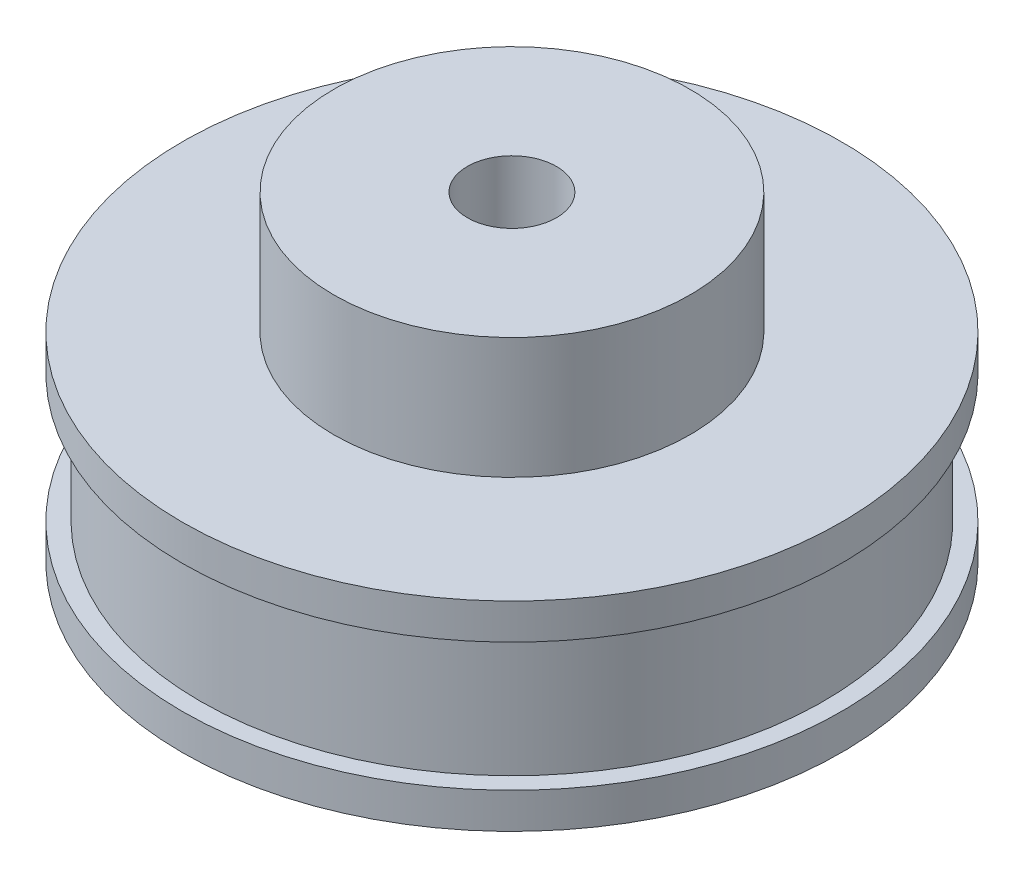
ISO-10303-21;
HEADER;
FILE_DESCRIPTION(('STEP AP214'),'2;1');
FILE_NAME('part.step','',(''),(''),'','','');
FILE_SCHEMA(('AUTOMOTIVE_DESIGN { 1 0 10303 214 1 1 1 1 }'));
ENDSEC;
DATA;
#1=APPLICATION_CONTEXT('core data for automotive mechanical design processes');
#2=APPLICATION_PROTOCOL_DEFINITION('international standard','automotive_design',2000,#1);
#3=PRODUCT_CONTEXT('',#1,'mechanical');
#4=PRODUCT('Part','Part','',(#3));
#5=PRODUCT_RELATED_PRODUCT_CATEGORY('part','',(#4));
#6=PRODUCT_DEFINITION_FORMATION('','',#4);
#7=PRODUCT_DEFINITION_CONTEXT('part definition',#1,'design');
#8=PRODUCT_DEFINITION('design','',#6,#7);
#9=PRODUCT_DEFINITION_SHAPE('','',#8);
#10=(LENGTH_UNIT() NAMED_UNIT(*) SI_UNIT(.MILLI.,.METRE.));
#11=(NAMED_UNIT(*) PLANE_ANGLE_UNIT() SI_UNIT($,.RADIAN.));
#12=(NAMED_UNIT(*) SI_UNIT($,.STERADIAN.) SOLID_ANGLE_UNIT());
#13=UNCERTAINTY_MEASURE_WITH_UNIT(LENGTH_MEASURE(1.E-05),#10,'distance_accuracy_value','');
#14=(GEOMETRIC_REPRESENTATION_CONTEXT(3) GLOBAL_UNCERTAINTY_ASSIGNED_CONTEXT((#13)) GLOBAL_UNIT_ASSIGNED_CONTEXT((#10,
#11,#12)) REPRESENTATION_CONTEXT('',''));
#15=CARTESIAN_POINT('',(0.,0.,0.));
#16=DIRECTION('',(0.,0.,1.));
#17=DIRECTION('',(1.,0.,0.));
#18=AXIS2_PLACEMENT_3D('',#15,#16,#17);
#19=CARTESIAN_POINT('',(0.,2.,0.));
#20=DIRECTION('',(0.,-1.,0.));
#21=DIRECTION('',(0.,0.,-1.));
#22=AXIS2_PLACEMENT_3D('',#19,#20,#21);
#23=CYLINDRICAL_SURFACE('',#22,18.5);
#24=CARTESIAN_POINT('',(0.,2.,0.));
#25=DIRECTION('',(0.,1.,0.));
#26=DIRECTION('',(0.,0.,1.));
#27=AXIS2_PLACEMENT_3D('',#24,#25,#26);
#28=CIRCLE('',#27,18.5);
#29=CARTESIAN_POINT('',(0.,2.,18.5));
#30=VERTEX_POINT('',#29);
#31=EDGE_CURVE('E48',#30,#30,#28,.T.);
#32=ORIENTED_EDGE('',*,*,#31,.F.);
#33=EDGE_LOOP('',(#32));
#34=FACE_BOUND('',#33,.T.);
#35=CARTESIAN_POINT('',(0.,0.,0.));
#36=DIRECTION('',(0.,1.,0.));
#37=DIRECTION('',(0.,0.,1.));
#38=AXIS2_PLACEMENT_3D('',#35,#36,#37);
#39=CIRCLE('',#38,18.5);
#40=CARTESIAN_POINT('',(0.,0.,18.5));
#41=VERTEX_POINT('',#40);
#42=EDGE_CURVE('E39',#41,#41,#39,.T.);
#43=ORIENTED_EDGE('',*,*,#42,.T.);
#44=EDGE_LOOP('',(#43));
#45=FACE_BOUND('',#44,.T.);
#46=ADVANCED_FACE('F36',(#34,#45),#23,.T.);
#47=CARTESIAN_POINT('',(0.,2.,0.));
#48=DIRECTION('',(0.,1.,0.));
#49=DIRECTION('',(0.,0.,1.));
#50=AXIS2_PLACEMENT_3D('',#47,#48,#49);
#51=PLANE('',#50);
#52=CARTESIAN_POINT('',(0.,2.,0.));
#53=DIRECTION('',(0.,1.,0.));
#54=DIRECTION('',(0.,0.,1.));
#55=AXIS2_PLACEMENT_3D('',#52,#53,#54);
#56=CIRCLE('',#55,17.5);
#57=CARTESIAN_POINT('',(0.,2.,17.5));
#58=VERTEX_POINT('',#57);
#59=EDGE_CURVE('E43',#58,#58,#56,.T.);
#60=ORIENTED_EDGE('',*,*,#59,.F.);
#61=EDGE_LOOP('',(#60));
#62=FACE_BOUND('',#61,.T.);
#63=ORIENTED_EDGE('',*,*,#31,.T.);
#64=EDGE_LOOP('',(#63));
#65=FACE_BOUND('',#64,.T.);
#66=ADVANCED_FACE('F72',(#62,#65),#51,.T.);
#67=CARTESIAN_POINT('',(0.,0.,0.));
#68=DIRECTION('',(0.,1.,0.));
#69=DIRECTION('',(0.,0.,1.));
#70=AXIS2_PLACEMENT_3D('',#67,#68,#69);
#71=PLANE('',#70);
#72=CARTESIAN_POINT('',(0.,0.,0.));
#73=DIRECTION('',(0.,1.,0.));
#74=DIRECTION('',(0.,0.,1.));
#75=AXIS2_PLACEMENT_3D('',#72,#73,#74);
#76=CIRCLE('',#75,2.5);
#77=CARTESIAN_POINT('',(0.,0.,2.5));
#78=VERTEX_POINT('',#77);
#79=EDGE_CURVE('E189',#78,#78,#76,.T.);
#80=ORIENTED_EDGE('',*,*,#79,.T.);
#81=EDGE_LOOP('',(#80));
#82=FACE_BOUND('',#81,.T.);
#83=ORIENTED_EDGE('',*,*,#42,.F.);
#84=EDGE_LOOP('',(#83));
#85=FACE_BOUND('',#84,.T.);
#86=ADVANCED_FACE('F69',(#82,#85),#71,.F.);
#87=CARTESIAN_POINT('',(0.,9.2,0.));
#88=DIRECTION('',(0.,-1.,0.));
#89=DIRECTION('',(0.,0.,-1.));
#90=AXIS2_PLACEMENT_3D('',#87,#88,#89);
#91=CYLINDRICAL_SURFACE('',#90,17.5);
#92=CARTESIAN_POINT('',(0.,9.2,0.));
#93=DIRECTION('',(0.,1.,0.));
#94=DIRECTION('',(0.,0.,1.));
#95=AXIS2_PLACEMENT_3D('',#92,#93,#94);
#96=CIRCLE('',#95,17.5);
#97=CARTESIAN_POINT('',(0.,9.2,17.5));
#98=VERTEX_POINT('',#97);
#99=EDGE_CURVE('E57',#98,#98,#96,.T.);
#100=ORIENTED_EDGE('',*,*,#99,.F.);
#101=EDGE_LOOP('',(#100));
#102=FACE_BOUND('',#101,.T.);
#103=ORIENTED_EDGE('',*,*,#59,.T.);
#104=EDGE_LOOP('',(#103));
#105=FACE_BOUND('',#104,.T.);
#106=ADVANCED_FACE('F71',(#102,#105),#91,.T.);
#107=CARTESIAN_POINT('',(0.,11.2,0.));
#108=DIRECTION('',(0.,-1.,0.));
#109=DIRECTION('',(0.,0.,-1.));
#110=AXIS2_PLACEMENT_3D('',#107,#108,#109);
#111=CYLINDRICAL_SURFACE('',#110,18.5);
#112=CARTESIAN_POINT('',(0.,11.2,0.));
#113=DIRECTION('',(0.,1.,0.));
#114=DIRECTION('',(0.,0.,1.));
#115=AXIS2_PLACEMENT_3D('',#112,#113,#114);
#116=CIRCLE('',#115,18.5);
#117=CARTESIAN_POINT('',(0.,11.2,18.5));
#118=VERTEX_POINT('',#117);
#119=EDGE_CURVE('E54',#118,#118,#116,.T.);
#120=ORIENTED_EDGE('',*,*,#119,.F.);
#121=EDGE_LOOP('',(#120));
#122=FACE_BOUND('',#121,.T.);
#123=CARTESIAN_POINT('',(0.,9.2,0.));
#124=DIRECTION('',(0.,1.,0.));
#125=DIRECTION('',(0.,0.,1.));
#126=AXIS2_PLACEMENT_3D('',#123,#124,#125);
#127=CIRCLE('',#126,18.5);
#128=CARTESIAN_POINT('',(0.,9.2,18.5));
#129=VERTEX_POINT('',#128);
#130=EDGE_CURVE('E58',#129,#129,#127,.T.);
#131=ORIENTED_EDGE('',*,*,#130,.T.);
#132=EDGE_LOOP('',(#131));
#133=FACE_BOUND('',#132,.T.);
#134=ADVANCED_FACE('F78',(#122,#133),#111,.T.);
#135=CARTESIAN_POINT('',(0.,11.2,0.));
#136=DIRECTION('',(0.,1.,0.));
#137=DIRECTION('',(0.,0.,1.));
#138=AXIS2_PLACEMENT_3D('',#135,#136,#137);
#139=PLANE('',#138);
#140=CARTESIAN_POINT('',(0.,11.2,0.));
#141=DIRECTION('',(0.,1.,0.));
#142=DIRECTION('',(0.,0.,1.));
#143=AXIS2_PLACEMENT_3D('',#140,#141,#142);
#144=CIRCLE('',#143,10.);
#145=CARTESIAN_POINT('',(0.,11.2,10.));
#146=VERTEX_POINT('',#145);
#147=EDGE_CURVE('E10',#146,#146,#144,.T.);
#148=ORIENTED_EDGE('',*,*,#147,.F.);
#149=EDGE_LOOP('',(#148));
#150=FACE_BOUND('',#149,.T.);
#151=ORIENTED_EDGE('',*,*,#119,.T.);
#152=EDGE_LOOP('',(#151));
#153=FACE_BOUND('',#152,.T.);
#154=ADVANCED_FACE('F110',(#150,#153),#139,.T.);
#155=CARTESIAN_POINT('',(0.,9.2,0.));
#156=DIRECTION('',(0.,1.,0.));
#157=DIRECTION('',(0.,0.,1.));
#158=AXIS2_PLACEMENT_3D('',#155,#156,#157);
#159=PLANE('',#158);
#160=ORIENTED_EDGE('',*,*,#99,.T.);
#161=EDGE_LOOP('',(#160));
#162=FACE_BOUND('',#161,.T.);
#163=ORIENTED_EDGE('',*,*,#130,.F.);
#164=EDGE_LOOP('',(#163));
#165=FACE_BOUND('',#164,.T.);
#166=ADVANCED_FACE('F119',(#162,#165),#159,.F.);
#167=CARTESIAN_POINT('',(0.,18.,0.));
#168=DIRECTION('',(0.,-1.,0.));
#169=DIRECTION('',(0.,0.,-1.));
#170=AXIS2_PLACEMENT_3D('',#167,#168,#169);
#171=CYLINDRICAL_SURFACE('',#170,10.);
#172=CARTESIAN_POINT('',(0.,18.,0.));
#173=DIRECTION('',(0.,1.,0.));
#174=DIRECTION('',(0.,0.,1.));
#175=AXIS2_PLACEMENT_3D('',#172,#173,#174);
#176=CIRCLE('',#175,10.);
#177=CARTESIAN_POINT('',(0.,18.,10.));
#178=VERTEX_POINT('',#177);
#179=EDGE_CURVE('E52',#178,#178,#176,.T.);
#180=ORIENTED_EDGE('',*,*,#179,.F.);
#181=EDGE_LOOP('',(#180));
#182=FACE_BOUND('',#181,.T.);
#183=ORIENTED_EDGE('',*,*,#147,.T.);
#184=EDGE_LOOP('',(#183));
#185=FACE_BOUND('',#184,.T.);
#186=ADVANCED_FACE('F124',(#182,#185),#171,.T.);
#187=CARTESIAN_POINT('',(0.,18.,0.));
#188=DIRECTION('',(0.,1.,0.));
#189=DIRECTION('',(0.,0.,1.));
#190=AXIS2_PLACEMENT_3D('',#187,#188,#189);
#191=PLANE('',#190);
#192=CARTESIAN_POINT('',(0.,18.,0.));
#193=DIRECTION('',(0.,1.,0.));
#194=DIRECTION('',(0.,0.,1.));
#195=AXIS2_PLACEMENT_3D('',#192,#193,#194);
#196=CIRCLE('',#195,2.5);
#197=CARTESIAN_POINT('',(0.,18.,2.5));
#198=VERTEX_POINT('',#197);
#199=EDGE_CURVE('E192',#198,#198,#196,.T.);
#200=ORIENTED_EDGE('',*,*,#199,.F.);
#201=EDGE_LOOP('',(#200));
#202=FACE_BOUND('',#201,.T.);
#203=ORIENTED_EDGE('',*,*,#179,.T.);
#204=EDGE_LOOP('',(#203));
#205=FACE_BOUND('',#204,.T.);
#206=ADVANCED_FACE('F142',(#202,#205),#191,.T.);
#207=CARTESIAN_POINT('',(0.,0.,0.));
#208=DIRECTION('',(0.,1.,0.));
#209=DIRECTION('',(0.,0.,1.));
#210=AXIS2_PLACEMENT_3D('',#207,#208,#209);
#211=CYLINDRICAL_SURFACE('',#210,2.5);
#212=ORIENTED_EDGE('',*,*,#79,.F.);
#213=EDGE_LOOP('',(#212));
#214=FACE_BOUND('',#213,.T.);
#215=ORIENTED_EDGE('',*,*,#199,.T.);
#216=EDGE_LOOP('',(#215));
#217=FACE_BOUND('',#216,.T.);
#218=ADVANCED_FACE('F158',(#214,#217),#211,.F.);
#219=CLOSED_SHELL('',(#46,#66,#86,#106,#134,#154,#166,#186,#206,#218));
#220=MANIFOLD_SOLID_BREP('B2',#219);
#221=ADVANCED_BREP_SHAPE_REPRESENTATION('',(#18,#220),#14);
#222=SHAPE_DEFINITION_REPRESENTATION(#9,#221);
ENDSEC;
END-ISO-10303-21;
